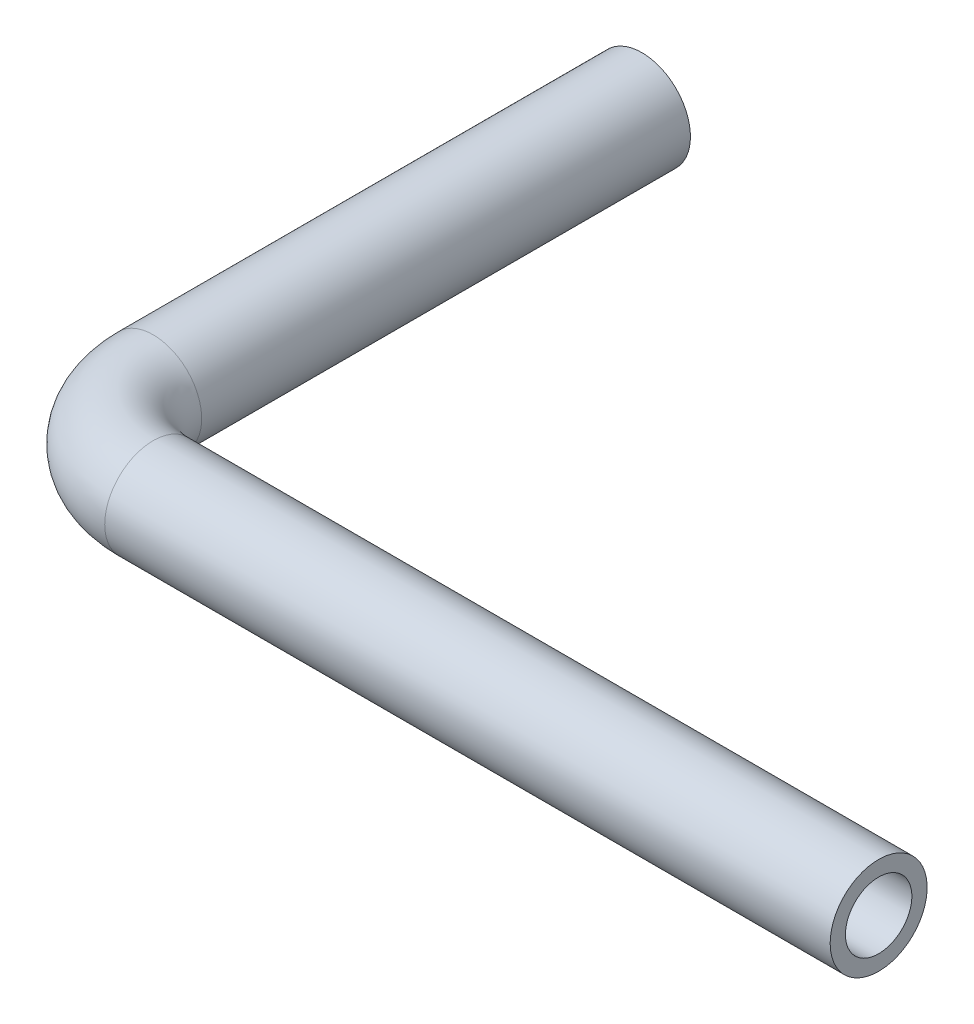
ISO-10303-21;
HEADER;
FILE_DESCRIPTION(('STEP AP214'),'2;1');
FILE_NAME('part.step','',(''),(''),'','','');
FILE_SCHEMA(('AUTOMOTIVE_DESIGN { 1 0 10303 214 1 1 1 1 }'));
ENDSEC;
DATA;
#1=APPLICATION_CONTEXT('core data for automotive mechanical design processes');
#2=APPLICATION_PROTOCOL_DEFINITION('international standard','automotive_design',2000,#1);
#3=PRODUCT_CONTEXT('',#1,'mechanical');
#4=PRODUCT('Part','Part','',(#3));
#5=PRODUCT_RELATED_PRODUCT_CATEGORY('part','',(#4));
#6=PRODUCT_DEFINITION_FORMATION('','',#4);
#7=PRODUCT_DEFINITION_CONTEXT('part definition',#1,'design');
#8=PRODUCT_DEFINITION('design','',#6,#7);
#9=PRODUCT_DEFINITION_SHAPE('','',#8);
#10=(LENGTH_UNIT() NAMED_UNIT(*) SI_UNIT(.MILLI.,.METRE.));
#11=(NAMED_UNIT(*) PLANE_ANGLE_UNIT() SI_UNIT($,.RADIAN.));
#12=(NAMED_UNIT(*) SI_UNIT($,.STERADIAN.) SOLID_ANGLE_UNIT());
#13=UNCERTAINTY_MEASURE_WITH_UNIT(LENGTH_MEASURE(1.E-05),#10,'distance_accuracy_value','');
#14=(GEOMETRIC_REPRESENTATION_CONTEXT(3) GLOBAL_UNCERTAINTY_ASSIGNED_CONTEXT((#13)) GLOBAL_UNIT_ASSIGNED_CONTEXT((#10,
#11,#12)) REPRESENTATION_CONTEXT('',''));
#15=CARTESIAN_POINT('',(0.,0.,0.));
#16=DIRECTION('',(0.,0.,1.));
#17=DIRECTION('',(1.,0.,0.));
#18=AXIS2_PLACEMENT_3D('',#15,#16,#17);
#19=CARTESIAN_POINT('',(-185.,40.,12.));
#20=DIRECTION('',(0.,0.,-1.));
#21=DIRECTION('',(-1.,0.,0.));
#22=AXIS2_PLACEMENT_3D('',#19,#20,#21);
#23=PLANE('',#22);
#24=CARTESIAN_POINT('',(-185.,40.,12.));
#25=DIRECTION('',(0.,0.,-1.));
#26=DIRECTION('',(-1.,0.,0.));
#27=AXIS2_PLACEMENT_3D('',#24,#25,#26);
#28=CIRCLE('',#27,2.175);
#29=CARTESIAN_POINT('',(-187.175,40.,12.));
#30=VERTEX_POINT('',#29);
#31=EDGE_CURVE('E88',#30,#30,#28,.T.);
#32=ORIENTED_EDGE('',*,*,#31,.F.);
#33=EDGE_LOOP('',(#32));
#34=FACE_BOUND('',#33,.T.);
#35=CARTESIAN_POINT('',(-185.,40.,12.));
#36=DIRECTION('',(0.,0.,-1.));
#37=DIRECTION('',(-1.,0.,0.));
#38=AXIS2_PLACEMENT_3D('',#35,#36,#37);
#39=CIRCLE('',#38,3.175);
#40=CARTESIAN_POINT('',(-188.175,40.,12.));
#41=VERTEX_POINT('',#40);
#42=EDGE_CURVE('E68',#41,#41,#39,.T.);
#43=ORIENTED_EDGE('',*,*,#42,.T.);
#44=EDGE_LOOP('',(#43));
#45=FACE_BOUND('',#44,.T.);
#46=ADVANCED_FACE('F52',(#34,#45),#23,.T.);
#47=CARTESIAN_POINT('',(-131.5,40.,50.));
#48=DIRECTION('',(-1.,0.,0.));
#49=DIRECTION('',(0.,0.,1.));
#50=AXIS2_PLACEMENT_3D('',#47,#48,#49);
#51=PLANE('',#50);
#52=CARTESIAN_POINT('',(-131.5,40.,50.));
#53=DIRECTION('',(-1.,0.,0.));
#54=DIRECTION('',(0.,0.,1.));
#55=AXIS2_PLACEMENT_3D('',#52,#53,#54);
#56=CIRCLE('',#55,2.175);
#57=CARTESIAN_POINT('',(-131.5,40.,52.175));
#58=VERTEX_POINT('',#57);
#59=EDGE_CURVE('E71',#58,#58,#56,.T.);
#60=ORIENTED_EDGE('',*,*,#59,.T.);
#61=EDGE_LOOP('',(#60));
#62=FACE_BOUND('',#61,.T.);
#63=CARTESIAN_POINT('',(-131.5,40.,50.));
#64=DIRECTION('',(-1.,0.,0.));
#65=DIRECTION('',(0.,0.,1.));
#66=AXIS2_PLACEMENT_3D('',#63,#64,#65);
#67=CIRCLE('',#66,3.175);
#68=CARTESIAN_POINT('',(-131.5,40.,53.175));
#69=VERTEX_POINT('',#68);
#70=EDGE_CURVE('E11',#69,#69,#67,.T.);
#71=ORIENTED_EDGE('',*,*,#70,.F.);
#72=EDGE_LOOP('',(#71));
#73=FACE_BOUND('',#72,.T.);
#74=ADVANCED_FACE('F91',(#62,#73),#51,.F.);
#75=CARTESIAN_POINT('',(-185.,40.,12.));
#76=DIRECTION('',(0.,0.,1.));
#77=DIRECTION('',(1.,0.,0.));
#78=AXIS2_PLACEMENT_3D('',#75,#76,#77);
#79=CYLINDRICAL_SURFACE('',#78,3.175);
#80=CARTESIAN_POINT('',(-185.,40.,44.));
#81=DIRECTION('',(0.,0.,1.));
#82=DIRECTION('',(1.,0.,0.));
#83=AXIS2_PLACEMENT_3D('',#80,#81,#82);
#84=CIRCLE('',#83,3.175);
#85=CARTESIAN_POINT('',(-188.175,40.,44.));
#86=VERTEX_POINT('',#85);
#87=EDGE_CURVE('E63',#86,#86,#84,.F.);
#88=ORIENTED_EDGE('',*,*,#87,.T.);
#89=EDGE_LOOP('',(#88));
#90=FACE_BOUND('',#89,.T.);
#91=ORIENTED_EDGE('',*,*,#42,.F.);
#92=EDGE_LOOP('',(#91));
#93=FACE_BOUND('',#92,.T.);
#94=ADVANCED_FACE('F97',(#90,#93),#79,.T.);
#95=CARTESIAN_POINT('',(-179.,40.,44.));
#96=DIRECTION('',(0.,1.,0.));
#97=DIRECTION('',(0.,0.,1.));
#98=AXIS2_PLACEMENT_3D('',#95,#96,#97);
#99=TOROIDAL_SURFACE('',#98,6.00000000000001,3.175);
#100=CARTESIAN_POINT('',(-179.,40.,50.));
#101=DIRECTION('',(-1.,0.,0.));
#102=DIRECTION('',(0.,0.,1.));
#103=AXIS2_PLACEMENT_3D('',#100,#101,#102);
#104=CIRCLE('',#103,3.175);
#105=CARTESIAN_POINT('',(-179.,40.,53.175));
#106=VERTEX_POINT('',#105);
#107=EDGE_CURVE('E58',#106,#106,#104,.T.);
#108=CARTESIAN_POINT('',(-179.,40.,44.));
#109=DIRECTION('',(0.,1.,0.));
#110=DIRECTION('',(0.,0.,1.));
#111=AXIS2_PLACEMENT_3D('',#108,#109,#110);
#112=CIRCLE('',#111,9.175);
#113=EDGE_CURVE('',#86,#106,#112,.T.);
#114=ORIENTED_EDGE('',*,*,#87,.F.);
#115=ORIENTED_EDGE('',*,*,#107,.T.);
#116=ORIENTED_EDGE('',*,*,#113,.T.);
#117=ORIENTED_EDGE('',*,*,#113,.F.);
#118=EDGE_LOOP('',(#114,#116,#115,#117));
#119=FACE_BOUND('',#118,.T.);
#120=ADVANCED_FACE('F110',(#119),#99,.T.);
#121=CARTESIAN_POINT('',(-179.,40.,50.));
#122=DIRECTION('',(1.,0.,0.));
#123=DIRECTION('',(0.,0.,-1.));
#124=AXIS2_PLACEMENT_3D('',#121,#122,#123);
#125=CYLINDRICAL_SURFACE('',#124,3.175);
#126=ORIENTED_EDGE('',*,*,#70,.T.);
#127=EDGE_LOOP('',(#126));
#128=FACE_BOUND('',#127,.T.);
#129=ORIENTED_EDGE('',*,*,#107,.F.);
#130=EDGE_LOOP('',(#129));
#131=FACE_BOUND('',#130,.T.);
#132=ADVANCED_FACE('F54',(#128,#131),#125,.T.);
#133=CARTESIAN_POINT('',(-185.,40.,12.));
#134=DIRECTION('',(0.,0.,1.));
#135=DIRECTION('',(1.,0.,0.));
#136=AXIS2_PLACEMENT_3D('',#133,#134,#135);
#137=CYLINDRICAL_SURFACE('',#136,2.175);
#138=CARTESIAN_POINT('',(-185.,40.,44.));
#139=DIRECTION('',(0.,0.,-1.));
#140=DIRECTION('',(-1.,0.,0.));
#141=AXIS2_PLACEMENT_3D('',#138,#139,#140);
#142=CIRCLE('',#141,2.175);
#143=CARTESIAN_POINT('',(-187.175,40.,44.));
#144=VERTEX_POINT('',#143);
#145=EDGE_CURVE('E81',#144,#144,#142,.T.);
#146=ORIENTED_EDGE('',*,*,#145,.F.);
#147=EDGE_LOOP('',(#146));
#148=FACE_BOUND('',#147,.T.);
#149=ORIENTED_EDGE('',*,*,#31,.T.);
#150=EDGE_LOOP('',(#149));
#151=FACE_BOUND('',#150,.T.);
#152=ADVANCED_FACE('F89',(#148,#151),#137,.F.);
#153=CARTESIAN_POINT('',(-179.,40.,44.));
#154=DIRECTION('',(0.,1.,0.));
#155=DIRECTION('',(0.,0.,1.));
#156=AXIS2_PLACEMENT_3D('',#153,#154,#155);
#157=TOROIDAL_SURFACE('',#156,6.00000000000001,2.175);
#158=CARTESIAN_POINT('',(-179.,40.,50.));
#159=DIRECTION('',(-1.,0.,0.));
#160=DIRECTION('',(0.,0.,1.));
#161=AXIS2_PLACEMENT_3D('',#158,#159,#160);
#162=CIRCLE('',#161,2.175);
#163=CARTESIAN_POINT('',(-179.,40.,52.175));
#164=VERTEX_POINT('',#163);
#165=EDGE_CURVE('E76',#164,#164,#162,.T.);
#166=CARTESIAN_POINT('',(-179.,40.,44.));
#167=DIRECTION('',(0.,1.,0.));
#168=DIRECTION('',(0.,0.,1.));
#169=AXIS2_PLACEMENT_3D('',#166,#167,#168);
#170=CIRCLE('',#169,8.175);
#171=EDGE_CURVE('',#144,#164,#170,.T.);
#172=ORIENTED_EDGE('',*,*,#145,.T.);
#173=ORIENTED_EDGE('',*,*,#165,.F.);
#174=ORIENTED_EDGE('',*,*,#171,.T.);
#175=ORIENTED_EDGE('',*,*,#171,.F.);
#176=EDGE_LOOP('',(#172,#174,#173,#175));
#177=FACE_BOUND('',#176,.T.);
#178=ADVANCED_FACE('F103',(#177),#157,.F.);
#179=CARTESIAN_POINT('',(-179.,40.,50.));
#180=DIRECTION('',(1.,0.,0.));
#181=DIRECTION('',(0.,0.,-1.));
#182=AXIS2_PLACEMENT_3D('',#179,#180,#181);
#183=CYLINDRICAL_SURFACE('',#182,2.175);
#184=ORIENTED_EDGE('',*,*,#59,.F.);
#185=EDGE_LOOP('',(#184));
#186=FACE_BOUND('',#185,.T.);
#187=ORIENTED_EDGE('',*,*,#165,.T.);
#188=EDGE_LOOP('',(#187));
#189=FACE_BOUND('',#188,.T.);
#190=ADVANCED_FACE('F92',(#186,#189),#183,.F.);
#191=CLOSED_SHELL('',(#46,#74,#94,#120,#132,#152,#178,#190));
#192=MANIFOLD_SOLID_BREP('B2',#191);
#193=ADVANCED_BREP_SHAPE_REPRESENTATION('',(#18,#192),#14);
#194=SHAPE_DEFINITION_REPRESENTATION(#9,#193);
ENDSEC;
END-ISO-10303-21;
